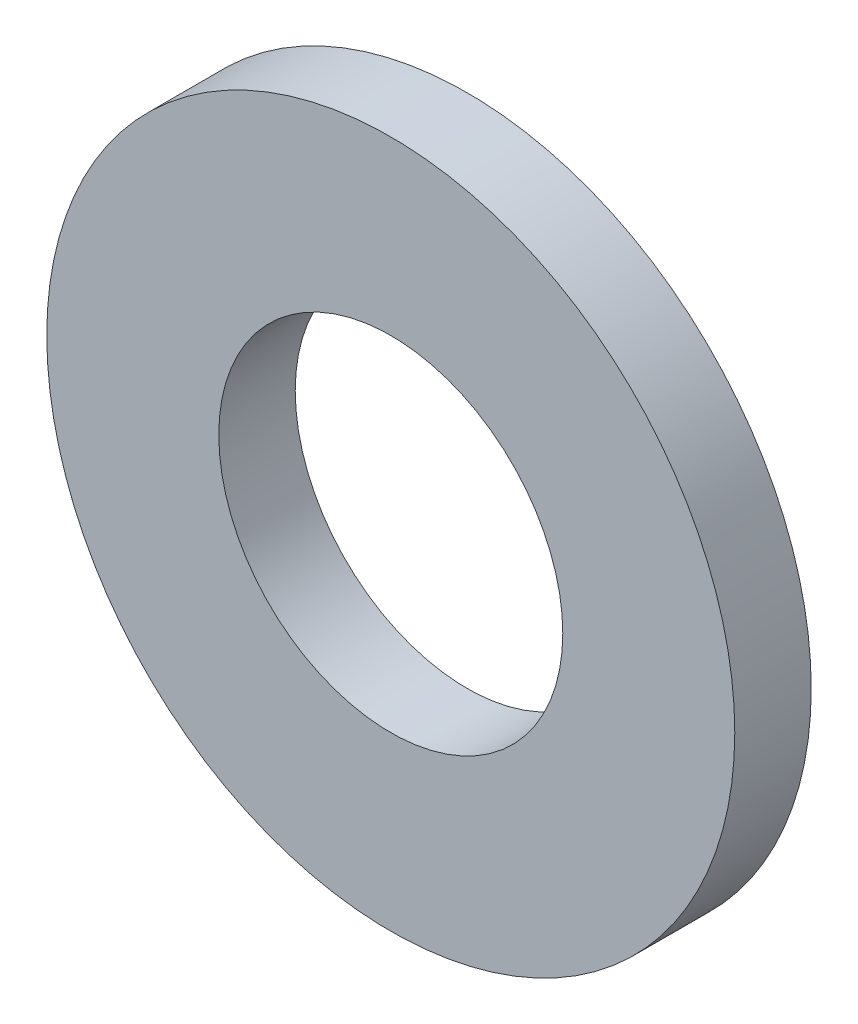
ISO-10303-21;
HEADER;
FILE_DESCRIPTION(('STEP AP214'),'2;1');
FILE_NAME('part.step','',(''),(''),'','','');
FILE_SCHEMA(('AUTOMOTIVE_DESIGN { 1 0 10303 214 1 1 1 1 }'));
ENDSEC;
DATA;
#1=APPLICATION_CONTEXT('core data for automotive mechanical design processes');
#2=APPLICATION_PROTOCOL_DEFINITION('international standard','automotive_design',2000,#1);
#3=PRODUCT_CONTEXT('',#1,'mechanical');
#4=PRODUCT('Part','Part','',(#3));
#5=PRODUCT_RELATED_PRODUCT_CATEGORY('part','',(#4));
#6=PRODUCT_DEFINITION_FORMATION('','',#4);
#7=PRODUCT_DEFINITION_CONTEXT('part definition',#1,'design');
#8=PRODUCT_DEFINITION('design','',#6,#7);
#9=PRODUCT_DEFINITION_SHAPE('','',#8);
#10=(LENGTH_UNIT() NAMED_UNIT(*) SI_UNIT(.MILLI.,.METRE.));
#11=(NAMED_UNIT(*) PLANE_ANGLE_UNIT() SI_UNIT($,.RADIAN.));
#12=(NAMED_UNIT(*) SI_UNIT($,.STERADIAN.) SOLID_ANGLE_UNIT());
#13=UNCERTAINTY_MEASURE_WITH_UNIT(LENGTH_MEASURE(1.E-05),#10,'distance_accuracy_value','');
#14=(GEOMETRIC_REPRESENTATION_CONTEXT(3) GLOBAL_UNCERTAINTY_ASSIGNED_CONTEXT((#13)) GLOBAL_UNIT_ASSIGNED_CONTEXT((#10,
#11,#12)) REPRESENTATION_CONTEXT('',''));
#15=CARTESIAN_POINT('',(0.,0.,0.));
#16=DIRECTION('',(0.,0.,1.));
#17=DIRECTION('',(1.,0.,0.));
#18=AXIS2_PLACEMENT_3D('',#15,#16,#17);
#19=CARTESIAN_POINT('',(0.,0.,1.));
#20=DIRECTION('',(0.,0.,-1.));
#21=DIRECTION('',(-1.,0.,0.));
#22=AXIS2_PLACEMENT_3D('',#19,#20,#21);
#23=CYLINDRICAL_SURFACE('',#22,4.5);
#24=CARTESIAN_POINT('',(0.,0.,1.));
#25=DIRECTION('',(0.,0.,1.));
#26=DIRECTION('',(1.,0.,0.));
#27=AXIS2_PLACEMENT_3D('',#24,#25,#26);
#28=CIRCLE('',#27,4.5);
#29=CARTESIAN_POINT('',(4.5,0.,1.));
#30=VERTEX_POINT('',#29);
#31=EDGE_CURVE('E10',#30,#30,#28,.T.);
#32=ORIENTED_EDGE('',*,*,#31,.F.);
#33=EDGE_LOOP('',(#32));
#34=FACE_BOUND('',#33,.T.);
#35=CARTESIAN_POINT('',(0.,0.,0.));
#36=DIRECTION('',(0.,0.,1.));
#37=DIRECTION('',(1.,0.,0.));
#38=AXIS2_PLACEMENT_3D('',#35,#36,#37);
#39=CIRCLE('',#38,4.5);
#40=CARTESIAN_POINT('',(4.5,0.,0.));
#41=VERTEX_POINT('',#40);
#42=EDGE_CURVE('E36',#41,#41,#39,.T.);
#43=ORIENTED_EDGE('',*,*,#42,.T.);
#44=EDGE_LOOP('',(#43));
#45=FACE_BOUND('',#44,.T.);
#46=ADVANCED_FACE('F33',(#34,#45),#23,.T.);
#47=CARTESIAN_POINT('',(0.,0.,1.));
#48=DIRECTION('',(0.,0.,1.));
#49=DIRECTION('',(1.,0.,0.));
#50=AXIS2_PLACEMENT_3D('',#47,#48,#49);
#51=PLANE('',#50);
#52=CARTESIAN_POINT('',(0.,0.,1.));
#53=DIRECTION('',(0.,0.,1.));
#54=DIRECTION('',(1.,0.,0.));
#55=AXIS2_PLACEMENT_3D('',#52,#53,#54);
#56=CIRCLE('',#55,2.25);
#57=CARTESIAN_POINT('',(2.25,0.,1.));
#58=VERTEX_POINT('',#57);
#59=EDGE_CURVE('E43',#58,#58,#56,.T.);
#60=ORIENTED_EDGE('',*,*,#59,.F.);
#61=EDGE_LOOP('',(#60));
#62=FACE_BOUND('',#61,.T.);
#63=ORIENTED_EDGE('',*,*,#31,.T.);
#64=EDGE_LOOP('',(#63));
#65=FACE_BOUND('',#64,.T.);
#66=ADVANCED_FACE('F54',(#62,#65),#51,.T.);
#67=CARTESIAN_POINT('',(0.,0.,0.));
#68=DIRECTION('',(0.,0.,1.));
#69=DIRECTION('',(1.,0.,0.));
#70=AXIS2_PLACEMENT_3D('',#67,#68,#69);
#71=PLANE('',#70);
#72=CARTESIAN_POINT('',(0.,0.,0.));
#73=DIRECTION('',(0.,0.,1.));
#74=DIRECTION('',(1.,0.,0.));
#75=AXIS2_PLACEMENT_3D('',#72,#73,#74);
#76=CIRCLE('',#75,2.25);
#77=CARTESIAN_POINT('',(2.25,0.,0.));
#78=VERTEX_POINT('',#77);
#79=EDGE_CURVE('E45',#78,#78,#76,.T.);
#80=ORIENTED_EDGE('',*,*,#79,.T.);
#81=EDGE_LOOP('',(#80));
#82=FACE_BOUND('',#81,.T.);
#83=ORIENTED_EDGE('',*,*,#42,.F.);
#84=EDGE_LOOP('',(#83));
#85=FACE_BOUND('',#84,.T.);
#86=ADVANCED_FACE('F56',(#82,#85),#71,.F.);
#87=CARTESIAN_POINT('',(0.,0.,1.));
#88=DIRECTION('',(0.,0.,-1.));
#89=DIRECTION('',(-1.,0.,0.));
#90=AXIS2_PLACEMENT_3D('',#87,#88,#89);
#91=CYLINDRICAL_SURFACE('',#90,2.25);
#92=ORIENTED_EDGE('',*,*,#59,.T.);
#93=EDGE_LOOP('',(#92));
#94=FACE_BOUND('',#93,.T.);
#95=ORIENTED_EDGE('',*,*,#79,.F.);
#96=EDGE_LOOP('',(#95));
#97=FACE_BOUND('',#96,.T.);
#98=ADVANCED_FACE('F51',(#94,#97),#91,.F.);
#99=CLOSED_SHELL('',(#46,#66,#86,#98));
#100=MANIFOLD_SOLID_BREP('B2',#99);
#101=ADVANCED_BREP_SHAPE_REPRESENTATION('',(#18,#100),#14);
#102=SHAPE_DEFINITION_REPRESENTATION(#9,#101);
ENDSEC;
END-ISO-10303-21;
